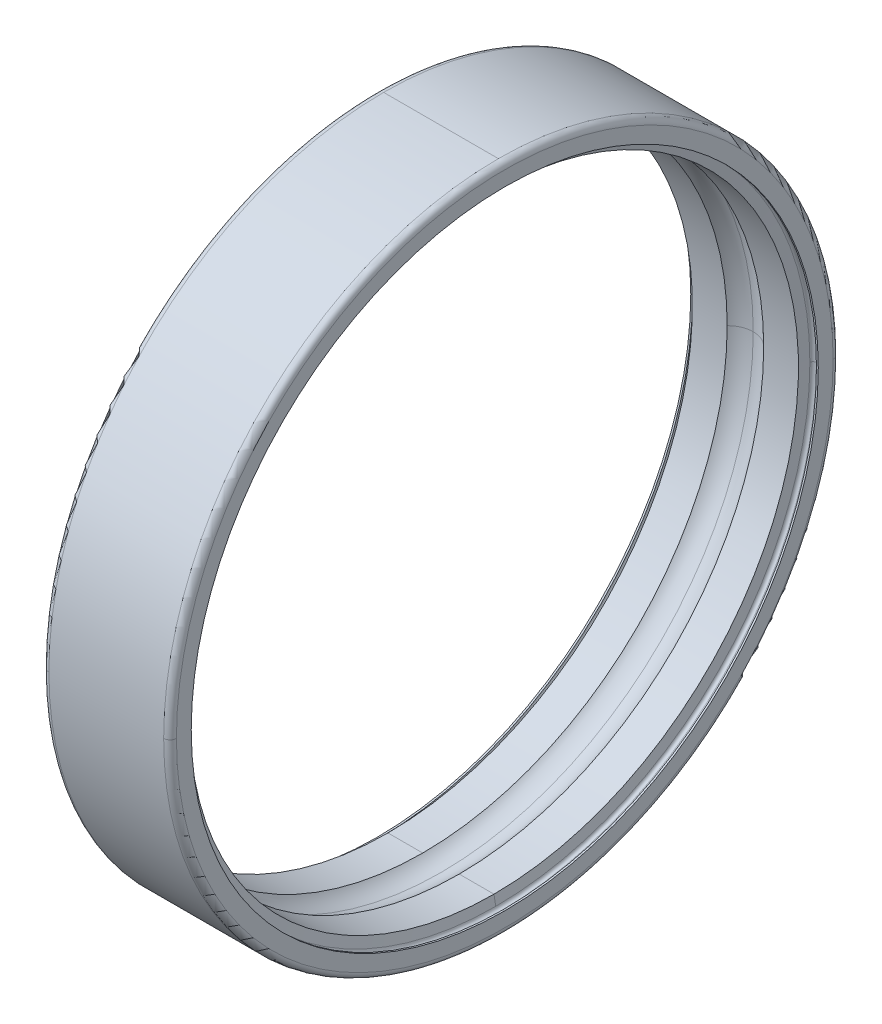
ISO-10303-21;
HEADER;
FILE_DESCRIPTION(('STEP AP214'),'2;1');
FILE_NAME('part.step','',(''),(''),'','','');
FILE_SCHEMA(('AUTOMOTIVE_DESIGN { 1 0 10303 214 1 1 1 1 }'));
ENDSEC;
DATA;
#1=APPLICATION_CONTEXT('core data for automotive mechanical design processes');
#2=APPLICATION_PROTOCOL_DEFINITION('international standard','automotive_design',2000,#1);
#3=PRODUCT_CONTEXT('',#1,'mechanical');
#4=PRODUCT('Part','Part','',(#3));
#5=PRODUCT_RELATED_PRODUCT_CATEGORY('part','',(#4));
#6=PRODUCT_DEFINITION_FORMATION('','',#4);
#7=PRODUCT_DEFINITION_CONTEXT('part definition',#1,'design');
#8=PRODUCT_DEFINITION('design','',#6,#7);
#9=PRODUCT_DEFINITION_SHAPE('','',#8);
#10=(LENGTH_UNIT() NAMED_UNIT(*) SI_UNIT(.MILLI.,.METRE.));
#11=(NAMED_UNIT(*) PLANE_ANGLE_UNIT() SI_UNIT($,.RADIAN.));
#12=(NAMED_UNIT(*) SI_UNIT($,.STERADIAN.) SOLID_ANGLE_UNIT());
#13=UNCERTAINTY_MEASURE_WITH_UNIT(LENGTH_MEASURE(1.E-05),#10,'distance_accuracy_value','');
#14=(GEOMETRIC_REPRESENTATION_CONTEXT(3) GLOBAL_UNCERTAINTY_ASSIGNED_CONTEXT((#13)) GLOBAL_UNIT_ASSIGNED_CONTEXT((#10,
#11,#12)) REPRESENTATION_CONTEXT('',''));
#15=CARTESIAN_POINT('',(0.,0.,0.));
#16=DIRECTION('',(0.,0.,1.));
#17=DIRECTION('',(1.,0.,0.));
#18=AXIS2_PLACEMENT_3D('',#15,#16,#17);
#19=CARTESIAN_POINT('',(3.829,0.,0.));
#20=DIRECTION('',(1.,0.,0.));
#21=DIRECTION('',(0.,0.,-1.));
#22=AXIS2_PLACEMENT_3D('',#19,#20,#21);
#23=TOROIDAL_SURFACE('',#22,9.835,0.114);
#24=CARTESIAN_POINT('',(3.829,0.,0.));
#25=DIRECTION('',(1.,0.,0.));
#26=DIRECTION('',(0.,0.,1.));
#27=AXIS2_PLACEMENT_3D('',#24,#25,#26);
#28=CIRCLE('',#27,9.949);
#29=CARTESIAN_POINT('',(3.829,0.,-9.949));
#30=VERTEX_POINT('',#29);
#31=CARTESIAN_POINT('',(3.829,0.,9.949));
#32=VERTEX_POINT('',#31);
#33=EDGE_CURVE('E184',#30,#32,#28,.T.);
#34=ORIENTED_EDGE('',*,*,#33,.T.);
#35=CARTESIAN_POINT('',(3.829,0.,9.835));
#36=DIRECTION('',(0.,-1.,0.));
#37=DIRECTION('',(0.,0.,1.));
#38=AXIS2_PLACEMENT_3D('',#35,#36,#37);
#39=CIRCLE('',#38,0.114);
#40=CARTESIAN_POINT('',(3.71673191615661,0.,9.85479589225403));
#41=VERTEX_POINT('',#40);
#42=EDGE_CURVE('E197',#32,#41,#39,.T.);
#43=ORIENTED_EDGE('',*,*,#42,.T.);
#44=CARTESIAN_POINT('',(3.71673191615661,0.,0.));
#45=DIRECTION('',(1.,0.,0.));
#46=DIRECTION('',(0.,1.,0.));
#47=AXIS2_PLACEMENT_3D('',#44,#45,#46);
#48=CIRCLE('',#47,9.85479589225403);
#49=CARTESIAN_POINT('',(3.71673191615661,9.85479589225403,0.));
#50=VERTEX_POINT('',#49);
#51=EDGE_CURVE('E31',#50,#41,#48,.T.);
#52=ORIENTED_EDGE('',*,*,#51,.F.);
#53=CARTESIAN_POINT('',(3.71673191615661,0.,0.));
#54=DIRECTION('',(1.,0.,0.));
#55=DIRECTION('',(0.,1.,0.));
#56=AXIS2_PLACEMENT_3D('',#53,#54,#55);
#57=CIRCLE('',#56,9.85479589225403);
#58=CARTESIAN_POINT('',(3.71673191615661,0.,-9.85479589225403));
#59=VERTEX_POINT('',#58);
#60=EDGE_CURVE('E185',#59,#50,#57,.T.);
#61=ORIENTED_EDGE('',*,*,#60,.F.);
#62=CARTESIAN_POINT('',(3.829,0.,-9.835));
#63=DIRECTION('',(0.,-1.,0.));
#64=DIRECTION('',(0.,0.,-1.));
#65=AXIS2_PLACEMENT_3D('',#62,#63,#64);
#66=CIRCLE('',#65,0.114);
#67=EDGE_CURVE('E181',#59,#30,#66,.T.);
#68=ORIENTED_EDGE('',*,*,#67,.T.);
#69=EDGE_LOOP('',(#34,#43,#52,#61,#68));
#70=FACE_BOUND('',#69,.T.);
#71=ADVANCED_FACE('F16',(#70),#23,.F.);
#72=CARTESIAN_POINT('',(3.9715,0.,0.));
#73=DIRECTION('',(1.,0.,0.));
#74=DIRECTION('',(0.,1.,0.));
#75=AXIS2_PLACEMENT_3D('',#72,#73,#74);
#76=CYLINDRICAL_SURFACE('',#75,9.835);
#77=DIRECTION('',(1.,0.,0.));
#78=VECTOR('',#77,1.);
#79=CARTESIAN_POINT('',(3.9715,9.835,0.));
#80=LINE('',#79,#78);
#81=CARTESIAN_POINT('',(3.943,9.835,0.));
#82=VERTEX_POINT('',#81);
#83=CARTESIAN_POINT('',(4.,9.835,0.));
#84=VERTEX_POINT('',#83);
#85=EDGE_CURVE('E313',#82,#84,#80,.T.);
#86=ORIENTED_EDGE('',*,*,#85,.T.);
#87=CARTESIAN_POINT('',(4.,0.,0.));
#88=DIRECTION('',(1.,0.,0.));
#89=DIRECTION('',(0.,1.,0.));
#90=AXIS2_PLACEMENT_3D('',#87,#88,#89);
#91=CIRCLE('',#90,9.835);
#92=CARTESIAN_POINT('',(4.,-9.835,0.));
#93=VERTEX_POINT('',#92);
#94=EDGE_CURVE('E11',#84,#93,#91,.T.);
#95=ORIENTED_EDGE('',*,*,#94,.T.);
#96=DIRECTION('',(-1.,0.,0.));
#97=VECTOR('',#96,1.);
#98=CARTESIAN_POINT('',(3.9715,-9.835,0.));
#99=LINE('',#98,#97);
#100=CARTESIAN_POINT('',(3.943,-9.835,0.));
#101=VERTEX_POINT('',#100);
#102=EDGE_CURVE('E321',#93,#101,#99,.T.);
#103=ORIENTED_EDGE('',*,*,#102,.T.);
#104=CARTESIAN_POINT('',(3.943,0.,0.));
#105=DIRECTION('',(1.,0.,0.));
#106=DIRECTION('',(0.,1.,0.));
#107=AXIS2_PLACEMENT_3D('',#104,#105,#106);
#108=CIRCLE('',#107,9.835);
#109=CARTESIAN_POINT('',(3.943,0.,9.835));
#110=VERTEX_POINT('',#109);
#111=EDGE_CURVE('E201',#110,#101,#108,.T.);
#112=ORIENTED_EDGE('',*,*,#111,.F.);
#113=CARTESIAN_POINT('',(3.943,0.,0.));
#114=DIRECTION('',(1.,0.,0.));
#115=DIRECTION('',(0.,1.,0.));
#116=AXIS2_PLACEMENT_3D('',#113,#114,#115);
#117=CIRCLE('',#116,9.835);
#118=EDGE_CURVE('E253',#82,#110,#117,.T.);
#119=ORIENTED_EDGE('',*,*,#118,.F.);
#120=EDGE_LOOP('',(#86,#95,#103,#112,#119));
#121=FACE_BOUND('',#120,.T.);
#122=ADVANCED_FACE('F18',(#121),#76,.F.);
#123=CARTESIAN_POINT('',(4.,10.0675,0.));
#124=DIRECTION('',(1.,0.,0.));
#125=DIRECTION('',(0.,1.,0.));
#126=AXIS2_PLACEMENT_3D('',#123,#124,#125);
#127=PLANE('',#126);
#128=ORIENTED_EDGE('',*,*,#94,.F.);
#129=CARTESIAN_POINT('',(4.,0.,0.));
#130=DIRECTION('',(1.,0.,0.));
#131=DIRECTION('',(0.,1.,0.));
#132=AXIS2_PLACEMENT_3D('',#129,#130,#131);
#133=CIRCLE('',#132,9.835);
#134=EDGE_CURVE('E328',#93,#84,#133,.T.);
#135=ORIENTED_EDGE('',*,*,#134,.F.);
#136=EDGE_LOOP('',(#128,#135));
#137=FACE_BOUND('',#136,.T.);
#138=CARTESIAN_POINT('',(4.,0.,0.));
#139=DIRECTION('',(1.,0.,0.));
#140=DIRECTION('',(0.,1.,0.));
#141=AXIS2_PLACEMENT_3D('',#138,#139,#140);
#142=CIRCLE('',#141,10.3);
#143=CARTESIAN_POINT('',(4.,0.,10.3));
#144=VERTEX_POINT('',#143);
#145=CARTESIAN_POINT('',(4.,0.,-10.3));
#146=VERTEX_POINT('',#145);
#147=EDGE_CURVE('E24',#144,#146,#142,.T.);
#148=ORIENTED_EDGE('',*,*,#147,.T.);
#149=CARTESIAN_POINT('',(4.,0.,0.));
#150=DIRECTION('',(1.,0.,0.));
#151=DIRECTION('',(0.,1.,0.));
#152=AXIS2_PLACEMENT_3D('',#149,#150,#151);
#153=CIRCLE('',#152,10.3);
#154=EDGE_CURVE('E338',#146,#144,#153,.T.);
#155=ORIENTED_EDGE('',*,*,#154,.T.);
#156=EDGE_LOOP('',(#148,#155));
#157=FACE_BOUND('',#156,.T.);
#158=ADVANCED_FACE('F402',(#137,#157),#127,.T.);
#159=CARTESIAN_POINT('',(3.8,0.,0.));
#160=DIRECTION('',(1.,0.,0.));
#161=DIRECTION('',(0.,0.,-1.));
#162=AXIS2_PLACEMENT_3D('',#159,#160,#161);
#163=TOROIDAL_SURFACE('',#162,10.3,0.2);
#164=CARTESIAN_POINT('',(3.8,0.,-10.3));
#165=DIRECTION('',(0.,-1.,0.));
#166=DIRECTION('',(0.,0.,-1.));
#167=AXIS2_PLACEMENT_3D('',#164,#165,#166);
#168=CIRCLE('',#167,0.2);
#169=CARTESIAN_POINT('',(3.8,0.,-10.5));
#170=VERTEX_POINT('',#169);
#171=EDGE_CURVE('E251',#170,#146,#168,.T.);
#172=ORIENTED_EDGE('',*,*,#171,.T.);
#173=ORIENTED_EDGE('',*,*,#147,.F.);
#174=CARTESIAN_POINT('',(3.8,0.,10.3));
#175=DIRECTION('',(0.,-1.,0.));
#176=DIRECTION('',(0.,0.,1.));
#177=AXIS2_PLACEMENT_3D('',#174,#175,#176);
#178=CIRCLE('',#177,0.2);
#179=CARTESIAN_POINT('',(3.8,0.,10.5));
#180=VERTEX_POINT('',#179);
#181=EDGE_CURVE('E335',#144,#180,#178,.T.);
#182=ORIENTED_EDGE('',*,*,#181,.T.);
#183=CARTESIAN_POINT('',(3.8,0.,0.));
#184=DIRECTION('',(1.,0.,0.));
#185=DIRECTION('',(0.,1.,0.));
#186=AXIS2_PLACEMENT_3D('',#183,#184,#185);
#187=CIRCLE('',#186,10.5);
#188=CARTESIAN_POINT('',(3.8,-10.5,0.));
#189=VERTEX_POINT('',#188);
#190=EDGE_CURVE('E317',#180,#189,#187,.T.);
#191=ORIENTED_EDGE('',*,*,#190,.T.);
#192=CARTESIAN_POINT('',(3.8,0.,0.));
#193=DIRECTION('',(1.,0.,0.));
#194=DIRECTION('',(0.,1.,0.));
#195=AXIS2_PLACEMENT_3D('',#192,#193,#194);
#196=CIRCLE('',#195,10.5);
#197=EDGE_CURVE('E233',#189,#170,#196,.T.);
#198=ORIENTED_EDGE('',*,*,#197,.T.);
#199=EDGE_LOOP('',(#172,#173,#182,#191,#198));
#200=FACE_BOUND('',#199,.T.);
#201=ADVANCED_FACE('F408',(#200),#163,.T.);
#202=CARTESIAN_POINT('',(2.,0.,0.));
#203=DIRECTION('',(1.,0.,0.));
#204=DIRECTION('',(0.,1.,0.));
#205=AXIS2_PLACEMENT_3D('',#202,#203,#204);
#206=CYLINDRICAL_SURFACE('',#205,10.5);
#207=DIRECTION('',(1.,0.,0.));
#208=VECTOR('',#207,1.);
#209=CARTESIAN_POINT('',(2.,10.5,0.));
#210=LINE('',#209,#208);
#211=CARTESIAN_POINT('',(0.2,10.5,0.));
#212=VERTEX_POINT('',#211);
#213=CARTESIAN_POINT('',(3.8,10.5,0.));
#214=VERTEX_POINT('',#213);
#215=EDGE_CURVE('E341',#212,#214,#210,.T.);
#216=ORIENTED_EDGE('',*,*,#215,.T.);
#217=CARTESIAN_POINT('',(3.8,0.,0.));
#218=DIRECTION('',(1.,0.,0.));
#219=DIRECTION('',(0.,1.,0.));
#220=AXIS2_PLACEMENT_3D('',#217,#218,#219);
#221=CIRCLE('',#220,10.5);
#222=EDGE_CURVE('E247',#170,#214,#221,.T.);
#223=ORIENTED_EDGE('',*,*,#222,.F.);
#224=ORIENTED_EDGE('',*,*,#197,.F.);
#225=DIRECTION('',(-1.,0.,0.));
#226=VECTOR('',#225,1.);
#227=CARTESIAN_POINT('',(2.,-10.5,0.));
#228=LINE('',#227,#226);
#229=CARTESIAN_POINT('',(0.2,-10.5,0.));
#230=VERTEX_POINT('',#229);
#231=EDGE_CURVE('E314',#189,#230,#228,.T.);
#232=ORIENTED_EDGE('',*,*,#231,.T.);
#233=CARTESIAN_POINT('',(0.2,0.,0.));
#234=DIRECTION('',(1.,0.,0.));
#235=DIRECTION('',(0.,1.,0.));
#236=AXIS2_PLACEMENT_3D('',#233,#234,#235);
#237=CIRCLE('',#236,10.5);
#238=CARTESIAN_POINT('',(0.2,0.,-10.5));
#239=VERTEX_POINT('',#238);
#240=EDGE_CURVE('E234',#230,#239,#237,.T.);
#241=ORIENTED_EDGE('',*,*,#240,.T.);
#242=CARTESIAN_POINT('',(0.2,0.,0.));
#243=DIRECTION('',(1.,0.,0.));
#244=DIRECTION('',(0.,1.,0.));
#245=AXIS2_PLACEMENT_3D('',#242,#243,#244);
#246=CIRCLE('',#245,10.5);
#247=EDGE_CURVE('E227',#239,#212,#246,.T.);
#248=ORIENTED_EDGE('',*,*,#247,.T.);
#249=EDGE_LOOP('',(#216,#223,#224,#232,#241,#248));
#250=FACE_BOUND('',#249,.T.);
#251=ADVANCED_FACE('F412',(#250),#206,.T.);
#252=CARTESIAN_POINT('',(0.2,0.,0.));
#253=DIRECTION('',(1.,0.,0.));
#254=DIRECTION('',(0.,0.,-1.));
#255=AXIS2_PLACEMENT_3D('',#252,#253,#254);
#256=TOROIDAL_SURFACE('',#255,10.3,0.2);
#257=CARTESIAN_POINT('',(0.2,0.,-10.3));
#258=DIRECTION('',(0.,-1.,0.));
#259=DIRECTION('',(0.,0.,-1.));
#260=AXIS2_PLACEMENT_3D('',#257,#258,#259);
#261=CIRCLE('',#260,0.2);
#262=CARTESIAN_POINT('',(0.,0.,-10.3));
#263=VERTEX_POINT('',#262);
#264=EDGE_CURVE('E243',#263,#239,#261,.T.);
#265=ORIENTED_EDGE('',*,*,#264,.T.);
#266=ORIENTED_EDGE('',*,*,#240,.F.);
#267=CARTESIAN_POINT('',(0.2,0.,0.));
#268=DIRECTION('',(1.,0.,0.));
#269=DIRECTION('',(0.,1.,0.));
#270=AXIS2_PLACEMENT_3D('',#267,#268,#269);
#271=CIRCLE('',#270,10.5);
#272=CARTESIAN_POINT('',(0.2,0.,10.5));
#273=VERTEX_POINT('',#272);
#274=EDGE_CURVE('E318',#273,#230,#271,.T.);
#275=ORIENTED_EDGE('',*,*,#274,.F.);
#276=CARTESIAN_POINT('',(0.2,0.,10.3));
#277=DIRECTION('',(0.,-1.,0.));
#278=DIRECTION('',(0.,0.,1.));
#279=AXIS2_PLACEMENT_3D('',#276,#277,#278);
#280=CIRCLE('',#279,0.2);
#281=CARTESIAN_POINT('',(0.,0.,10.3));
#282=VERTEX_POINT('',#281);
#283=EDGE_CURVE('E242',#273,#282,#280,.T.);
#284=ORIENTED_EDGE('',*,*,#283,.T.);
#285=CARTESIAN_POINT('',(0.,0.,0.));
#286=DIRECTION('',(1.,0.,0.));
#287=DIRECTION('',(0.,1.,0.));
#288=AXIS2_PLACEMENT_3D('',#285,#286,#287);
#289=CIRCLE('',#288,10.3);
#290=EDGE_CURVE('E221',#282,#263,#289,.T.);
#291=ORIENTED_EDGE('',*,*,#290,.T.);
#292=EDGE_LOOP('',(#265,#266,#275,#284,#291));
#293=FACE_BOUND('',#292,.T.);
#294=ADVANCED_FACE('F424',(#293),#256,.T.);
#295=CARTESIAN_POINT('',(0.,10.0675,0.));
#296=DIRECTION('',(-1.,0.,0.));
#297=DIRECTION('',(0.,0.,1.));
#298=AXIS2_PLACEMENT_3D('',#295,#296,#297);
#299=PLANE('',#298);
#300=CARTESIAN_POINT('',(0.,0.,0.));
#301=DIRECTION('',(1.,0.,0.));
#302=DIRECTION('',(0.,1.,0.));
#303=AXIS2_PLACEMENT_3D('',#300,#301,#302);
#304=CIRCLE('',#303,9.835);
#305=CARTESIAN_POINT('',(0.,9.835,0.));
#306=VERTEX_POINT('',#305);
#307=CARTESIAN_POINT('',(0.,-9.835,0.));
#308=VERTEX_POINT('',#307);
#309=EDGE_CURVE('E219',#306,#308,#304,.T.);
#310=ORIENTED_EDGE('',*,*,#309,.T.);
#311=CARTESIAN_POINT('',(0.,0.,0.));
#312=DIRECTION('',(1.,0.,0.));
#313=DIRECTION('',(0.,1.,0.));
#314=AXIS2_PLACEMENT_3D('',#311,#312,#313);
#315=CIRCLE('',#314,9.835);
#316=EDGE_CURVE('E226',#308,#306,#315,.T.);
#317=ORIENTED_EDGE('',*,*,#316,.T.);
#318=EDGE_LOOP('',(#310,#317));
#319=FACE_BOUND('',#318,.T.);
#320=CARTESIAN_POINT('',(0.,0.,0.));
#321=DIRECTION('',(1.,0.,0.));
#322=DIRECTION('',(0.,1.,0.));
#323=AXIS2_PLACEMENT_3D('',#320,#321,#322);
#324=CIRCLE('',#323,10.3);
#325=EDGE_CURVE('E239',#263,#282,#324,.T.);
#326=ORIENTED_EDGE('',*,*,#325,.F.);
#327=ORIENTED_EDGE('',*,*,#290,.F.);
#328=EDGE_LOOP('',(#326,#327));
#329=FACE_BOUND('',#328,.T.);
#330=ADVANCED_FACE('F427',(#319,#329),#299,.T.);
#331=CARTESIAN_POINT('',(0.0285,0.,0.));
#332=DIRECTION('',(1.,0.,0.));
#333=DIRECTION('',(0.,1.,0.));
#334=AXIS2_PLACEMENT_3D('',#331,#332,#333);
#335=CYLINDRICAL_SURFACE('',#334,9.835);
#336=DIRECTION('',(1.,0.,0.));
#337=VECTOR('',#336,1.);
#338=CARTESIAN_POINT('',(0.0285,9.835,0.));
#339=LINE('',#338,#337);
#340=CARTESIAN_POINT('',(0.057,9.835,0.));
#341=VERTEX_POINT('',#340);
#342=EDGE_CURVE('E223',#306,#341,#339,.T.);
#343=ORIENTED_EDGE('',*,*,#342,.T.);
#344=CARTESIAN_POINT('',(0.057,0.,0.));
#345=DIRECTION('',(1.,0.,0.));
#346=DIRECTION('',(0.,1.,0.));
#347=AXIS2_PLACEMENT_3D('',#344,#345,#346);
#348=CIRCLE('',#347,9.835);
#349=CARTESIAN_POINT('',(0.057,0.,9.835));
#350=VERTEX_POINT('',#349);
#351=EDGE_CURVE('E222',#341,#350,#348,.T.);
#352=ORIENTED_EDGE('',*,*,#351,.T.);
#353=CARTESIAN_POINT('',(0.057,0.,0.));
#354=DIRECTION('',(1.,0.,0.));
#355=DIRECTION('',(0.,1.,0.));
#356=AXIS2_PLACEMENT_3D('',#353,#354,#355);
#357=CIRCLE('',#356,9.835);
#358=CARTESIAN_POINT('',(0.057,-9.835,0.));
#359=VERTEX_POINT('',#358);
#360=EDGE_CURVE('E371',#350,#359,#357,.T.);
#361=ORIENTED_EDGE('',*,*,#360,.T.);
#362=DIRECTION('',(-1.,0.,0.));
#363=VECTOR('',#362,1.);
#364=CARTESIAN_POINT('',(0.0285,-9.835,0.));
#365=LINE('',#364,#363);
#366=EDGE_CURVE('E360',#359,#308,#365,.T.);
#367=ORIENTED_EDGE('',*,*,#366,.T.);
#368=ORIENTED_EDGE('',*,*,#309,.F.);
#369=EDGE_LOOP('',(#343,#352,#361,#367,#368));
#370=FACE_BOUND('',#369,.T.);
#371=ADVANCED_FACE('F429',(#370),#335,.F.);
#372=CARTESIAN_POINT('',(0.171,0.,0.));
#373=DIRECTION('',(1.,0.,0.));
#374=DIRECTION('',(0.,0.,-1.));
#375=AXIS2_PLACEMENT_3D('',#372,#373,#374);
#376=TOROIDAL_SURFACE('',#375,9.835,0.114);
#377=CARTESIAN_POINT('',(0.171,0.,0.));
#378=DIRECTION('',(1.,0.,0.));
#379=DIRECTION('',(0.,0.,1.));
#380=AXIS2_PLACEMENT_3D('',#377,#378,#379);
#381=CIRCLE('',#380,9.949);
#382=CARTESIAN_POINT('',(0.171,0.,-9.949));
#383=VERTEX_POINT('',#382);
#384=CARTESIAN_POINT('',(0.171,0.,9.949));
#385=VERTEX_POINT('',#384);
#386=EDGE_CURVE('E266',#383,#385,#381,.T.);
#387=ORIENTED_EDGE('',*,*,#386,.T.);
#388=CARTESIAN_POINT('',(0.171,0.,9.835));
#389=DIRECTION('',(0.,-1.,0.));
#390=DIRECTION('',(0.,0.,1.));
#391=AXIS2_PLACEMENT_3D('',#388,#389,#390);
#392=CIRCLE('',#391,0.114);
#393=EDGE_CURVE('E373',#385,#350,#392,.T.);
#394=ORIENTED_EDGE('',*,*,#393,.T.);
#395=ORIENTED_EDGE('',*,*,#351,.F.);
#396=CARTESIAN_POINT('',(0.057,0.,0.));
#397=DIRECTION('',(1.,0.,0.));
#398=DIRECTION('',(0.,1.,0.));
#399=AXIS2_PLACEMENT_3D('',#396,#397,#398);
#400=CIRCLE('',#399,9.835);
#401=CARTESIAN_POINT('',(0.057,0.,-9.835));
#402=VERTEX_POINT('',#401);
#403=EDGE_CURVE('E366',#402,#341,#400,.T.);
#404=ORIENTED_EDGE('',*,*,#403,.F.);
#405=CARTESIAN_POINT('',(0.171,0.,-9.835));
#406=DIRECTION('',(0.,-1.,0.));
#407=DIRECTION('',(0.,0.,-1.));
#408=AXIS2_PLACEMENT_3D('',#405,#406,#407);
#409=CIRCLE('',#408,0.114);
#410=EDGE_CURVE('E369',#402,#383,#409,.T.);
#411=ORIENTED_EDGE('',*,*,#410,.T.);
#412=EDGE_LOOP('',(#387,#394,#395,#404,#411));
#413=FACE_BOUND('',#412,.T.);
#414=ADVANCED_FACE('F437',(#413),#376,.F.);
#415=CARTESIAN_POINT('',(0.31013995355014,0.,0.));
#416=DIRECTION('',(-1.,0.,0.));
#417=DIRECTION('',(0.,1.,0.));
#418=AXIS2_PLACEMENT_3D('',#415,#416,#417);
#419=CONICAL_SURFACE('',#418,9.70239794612702,1.39626340159546);
#420=DIRECTION('',(0.173648177666931,-0.984807753012208,0.));
#421=VECTOR('',#420,1.);
#422=CARTESIAN_POINT('',(0.31013995355014,9.70239794612702,0.));
#423=LINE('',#422,#421);
#424=CARTESIAN_POINT('',(0.283268083843392,9.85479589225403,0.));
#425=VERTEX_POINT('',#424);
#426=CARTESIAN_POINT('',(0.337011823256887,9.55,0.));
#427=VERTEX_POINT('',#426);
#428=EDGE_CURVE('E376',#425,#427,#423,.T.);
#429=ORIENTED_EDGE('',*,*,#428,.T.);
#430=CARTESIAN_POINT('',(0.337011823256887,0.,0.));
#431=DIRECTION('',(1.,0.,0.));
#432=DIRECTION('',(0.,1.,0.));
#433=AXIS2_PLACEMENT_3D('',#430,#431,#432);
#434=CIRCLE('',#433,9.55);
#435=CARTESIAN_POINT('',(0.337011823256888,-9.55,0.));
#436=VERTEX_POINT('',#435);
#437=EDGE_CURVE('E236',#427,#436,#434,.T.);
#438=ORIENTED_EDGE('',*,*,#437,.T.);
#439=DIRECTION('',(-0.173648177666931,-0.984807753012208,0.));
#440=VECTOR('',#439,1.);
#441=CARTESIAN_POINT('',(0.31013995355014,-9.70239794612702,0.));
#442=LINE('',#441,#440);
#443=CARTESIAN_POINT('',(0.283268083843392,-9.85479589225403,0.));
#444=VERTEX_POINT('',#443);
#445=EDGE_CURVE('E326',#436,#444,#442,.T.);
#446=ORIENTED_EDGE('',*,*,#445,.T.);
#447=CARTESIAN_POINT('',(0.283268083843392,0.,0.));
#448=DIRECTION('',(1.,0.,0.));
#449=DIRECTION('',(0.,1.,0.));
#450=AXIS2_PLACEMENT_3D('',#447,#448,#449);
#451=CIRCLE('',#450,9.85479589225403);
#452=CARTESIAN_POINT('',(0.283268083843392,0.,9.85479589225403));
#453=VERTEX_POINT('',#452);
#454=EDGE_CURVE('E295',#453,#444,#451,.T.);
#455=ORIENTED_EDGE('',*,*,#454,.F.);
#456=CARTESIAN_POINT('',(0.283268083843392,0.,0.));
#457=DIRECTION('',(1.,0.,0.));
#458=DIRECTION('',(0.,1.,0.));
#459=AXIS2_PLACEMENT_3D('',#456,#457,#458);
#460=CIRCLE('',#459,9.85479589225403);
#461=EDGE_CURVE('E275',#425,#453,#460,.T.);
#462=ORIENTED_EDGE('',*,*,#461,.F.);
#463=EDGE_LOOP('',(#429,#438,#446,#455,#462));
#464=FACE_BOUND('',#463,.T.);
#465=ADVANCED_FACE('F478',(#464),#419,.F.);
#466=CARTESIAN_POINT('',(0.882177428937674,0.,0.));
#467=DIRECTION('',(1.,0.,0.));
#468=DIRECTION('',(0.,1.,0.));
#469=AXIS2_PLACEMENT_3D('',#466,#467,#468);
#470=CYLINDRICAL_SURFACE('',#469,9.55);
#471=DIRECTION('',(1.,0.,0.));
#472=VECTOR('',#471,1.);
#473=CARTESIAN_POINT('',(0.882177428937674,9.55,0.));
#474=LINE('',#473,#472);
#475=CARTESIAN_POINT('',(1.42734303461846,9.55,0.));
#476=VERTEX_POINT('',#475);
#477=EDGE_CURVE('E325',#427,#476,#474,.T.);
#478=ORIENTED_EDGE('',*,*,#477,.T.);
#479=CARTESIAN_POINT('',(1.42734303461846,0.,0.));
#480=DIRECTION('',(1.,0.,0.));
#481=DIRECTION('',(0.,1.,0.));
#482=AXIS2_PLACEMENT_3D('',#479,#480,#481);
#483=CIRCLE('',#482,9.55);
#484=CARTESIAN_POINT('',(1.42734303461846,0.,9.55));
#485=VERTEX_POINT('',#484);
#486=EDGE_CURVE('E238',#476,#485,#483,.T.);
#487=ORIENTED_EDGE('',*,*,#486,.T.);
#488=CARTESIAN_POINT('',(1.42734303461846,0.,0.));
#489=DIRECTION('',(1.,0.,0.));
#490=DIRECTION('',(0.,1.,0.));
#491=AXIS2_PLACEMENT_3D('',#488,#489,#490);
#492=CIRCLE('',#491,9.55);
#493=CARTESIAN_POINT('',(1.42734303461846,-9.55,0.));
#494=VERTEX_POINT('',#493);
#495=EDGE_CURVE('E310',#485,#494,#492,.T.);
#496=ORIENTED_EDGE('',*,*,#495,.T.);
#497=DIRECTION('',(-1.,0.,0.));
#498=VECTOR('',#497,1.);
#499=CARTESIAN_POINT('',(0.882177428937674,-9.55,0.));
#500=LINE('',#499,#498);
#501=EDGE_CURVE('E382',#494,#436,#500,.T.);
#502=ORIENTED_EDGE('',*,*,#501,.T.);
#503=ORIENTED_EDGE('',*,*,#437,.F.);
#504=EDGE_LOOP('',(#478,#487,#496,#502,#503));
#505=FACE_BOUND('',#504,.T.);
#506=ADVANCED_FACE('F475',(#505),#470,.F.);
#507=CARTESIAN_POINT('',(2.,0.,0.));
#508=DIRECTION('',(1.,0.,0.));
#509=DIRECTION('',(0.,0.,-1.));
#510=AXIS2_PLACEMENT_3D('',#507,#508,#509);
#511=TOROIDAL_SURFACE('',#510,9.,0.794);
#512=CARTESIAN_POINT('',(2.,0.,0.));
#513=DIRECTION('',(1.,0.,0.));
#514=DIRECTION('',(0.,0.,1.));
#515=AXIS2_PLACEMENT_3D('',#512,#513,#514);
#516=CIRCLE('',#515,9.794);
#517=CARTESIAN_POINT('',(2.,0.,-9.794));
#518=VERTEX_POINT('',#517);
#519=CARTESIAN_POINT('',(2.,0.,9.794));
#520=VERTEX_POINT('',#519);
#521=EDGE_CURVE('E260',#518,#520,#516,.T.);
#522=ORIENTED_EDGE('',*,*,#521,.T.);
#523=CARTESIAN_POINT('',(2.,0.,9.));
#524=DIRECTION('',(0.,-1.,0.));
#525=DIRECTION('',(0.,0.,1.));
#526=AXIS2_PLACEMENT_3D('',#523,#524,#525);
#527=CIRCLE('',#526,0.794);
#528=EDGE_CURVE('E264',#520,#485,#527,.T.);
#529=ORIENTED_EDGE('',*,*,#528,.T.);
#530=ORIENTED_EDGE('',*,*,#486,.F.);
#531=CARTESIAN_POINT('',(1.42734303461846,0.,0.));
#532=DIRECTION('',(1.,0.,0.));
#533=DIRECTION('',(0.,1.,0.));
#534=AXIS2_PLACEMENT_3D('',#531,#532,#533);
#535=CIRCLE('',#534,9.55);
#536=CARTESIAN_POINT('',(1.42734303461846,0.,-9.55));
#537=VERTEX_POINT('',#536);
#538=EDGE_CURVE('E301',#537,#476,#535,.T.);
#539=ORIENTED_EDGE('',*,*,#538,.F.);
#540=CARTESIAN_POINT('',(2.,0.,-9.));
#541=DIRECTION('',(0.,-1.,0.));
#542=DIRECTION('',(0.,0.,-1.));
#543=AXIS2_PLACEMENT_3D('',#540,#541,#542);
#544=CIRCLE('',#543,0.794);
#545=EDGE_CURVE('E304',#537,#518,#544,.T.);
#546=ORIENTED_EDGE('',*,*,#545,.T.);
#547=EDGE_LOOP('',(#522,#529,#530,#539,#546));
#548=FACE_BOUND('',#547,.T.);
#549=ADVANCED_FACE('F474',(#548),#511,.F.);
#550=CARTESIAN_POINT('',(3.11782257106233,0.,0.));
#551=DIRECTION('',(1.,0.,0.));
#552=DIRECTION('',(0.,1.,0.));
#553=AXIS2_PLACEMENT_3D('',#550,#551,#552);
#554=CYLINDRICAL_SURFACE('',#553,9.55);
#555=DIRECTION('',(1.,0.,0.));
#556=VECTOR('',#555,1.);
#557=CARTESIAN_POINT('',(3.11782257106233,9.55,0.));
#558=LINE('',#557,#556);
#559=CARTESIAN_POINT('',(2.57265696538154,9.55,0.));
#560=VERTEX_POINT('',#559);
#561=CARTESIAN_POINT('',(3.66298817674311,9.55,0.));
#562=VERTEX_POINT('',#561);
#563=EDGE_CURVE('E261',#560,#562,#558,.T.);
#564=ORIENTED_EDGE('',*,*,#563,.T.);
#565=CARTESIAN_POINT('',(3.66298817674311,0.,0.));
#566=DIRECTION('',(1.,0.,0.));
#567=DIRECTION('',(0.,1.,0.));
#568=AXIS2_PLACEMENT_3D('',#565,#566,#567);
#569=CIRCLE('',#568,9.55);
#570=CARTESIAN_POINT('',(3.66298817674311,-9.55,0.));
#571=VERTEX_POINT('',#570);
#572=EDGE_CURVE('E39',#562,#571,#569,.T.);
#573=ORIENTED_EDGE('',*,*,#572,.T.);
#574=DIRECTION('',(-1.,0.,0.));
#575=VECTOR('',#574,1.);
#576=CARTESIAN_POINT('',(3.11782257106233,-9.55,0.));
#577=LINE('',#576,#575);
#578=CARTESIAN_POINT('',(2.57265696538154,-9.55,0.));
#579=VERTEX_POINT('',#578);
#580=EDGE_CURVE('E263',#571,#579,#577,.T.);
#581=ORIENTED_EDGE('',*,*,#580,.T.);
#582=CARTESIAN_POINT('',(2.57265696538154,0.,0.));
#583=DIRECTION('',(1.,0.,0.));
#584=DIRECTION('',(0.,1.,0.));
#585=AXIS2_PLACEMENT_3D('',#582,#583,#584);
#586=CIRCLE('',#585,9.55);
#587=CARTESIAN_POINT('',(2.57265696538154,0.,9.55));
#588=VERTEX_POINT('',#587);
#589=EDGE_CURVE('E285',#588,#579,#586,.T.);
#590=ORIENTED_EDGE('',*,*,#589,.F.);
#591=CARTESIAN_POINT('',(2.57265696538154,0.,0.));
#592=DIRECTION('',(1.,0.,0.));
#593=DIRECTION('',(0.,1.,0.));
#594=AXIS2_PLACEMENT_3D('',#591,#592,#593);
#595=CIRCLE('',#594,9.55);
#596=EDGE_CURVE('E231',#560,#588,#595,.T.);
#597=ORIENTED_EDGE('',*,*,#596,.F.);
#598=EDGE_LOOP('',(#564,#573,#581,#590,#597));
#599=FACE_BOUND('',#598,.T.);
#600=ADVANCED_FACE('F470',(#599),#554,.F.);
#601=CARTESIAN_POINT('',(3.68986004644986,0.,0.));
#602=DIRECTION('',(1.,0.,0.));
#603=DIRECTION('',(0.,1.,0.));
#604=AXIS2_PLACEMENT_3D('',#601,#602,#603);
#605=CONICAL_SURFACE('',#604,9.70239794612702,1.39626340159546);
#606=DIRECTION('',(0.173648177666931,0.984807753012208,0.));
#607=VECTOR('',#606,1.);
#608=CARTESIAN_POINT('',(3.68986004644986,9.70239794612702,0.));
#609=LINE('',#608,#607);
#610=EDGE_CURVE('E392',#562,#50,#609,.T.);
#611=ORIENTED_EDGE('',*,*,#610,.T.);
#612=ORIENTED_EDGE('',*,*,#51,.T.);
#613=CARTESIAN_POINT('',(3.71673191615661,0.,0.));
#614=DIRECTION('',(1.,0.,0.));
#615=DIRECTION('',(0.,1.,0.));
#616=AXIS2_PLACEMENT_3D('',#613,#614,#615);
#617=CIRCLE('',#616,9.85479589225403);
#618=CARTESIAN_POINT('',(3.71673191615661,-9.85479589225403,0.));
#619=VERTEX_POINT('',#618);
#620=EDGE_CURVE('E307',#41,#619,#617,.T.);
#621=ORIENTED_EDGE('',*,*,#620,.T.);
#622=DIRECTION('',(-0.173648177666931,0.984807753012208,0.));
#623=VECTOR('',#622,1.);
#624=CARTESIAN_POINT('',(3.68986004644986,-9.70239794612702,0.));
#625=LINE('',#624,#623);
#626=EDGE_CURVE('E395',#619,#571,#625,.T.);
#627=ORIENTED_EDGE('',*,*,#626,.T.);
#628=ORIENTED_EDGE('',*,*,#572,.F.);
#629=EDGE_LOOP('',(#611,#612,#621,#627,#628));
#630=FACE_BOUND('',#629,.T.);
#631=ADVANCED_FACE('F466',(#630),#605,.F.);
#632=CARTESIAN_POINT('',(3.68986004644986,0.,0.));
#633=DIRECTION('',(1.,0.,0.));
#634=DIRECTION('',(0.,1.,0.));
#635=AXIS2_PLACEMENT_3D('',#632,#633,#634);
#636=CONICAL_SURFACE('',#635,9.70239794612702,1.39626340159546);
#637=ORIENTED_EDGE('',*,*,#610,.F.);
#638=CARTESIAN_POINT('',(3.66298817674311,0.,0.));
#639=DIRECTION('',(1.,0.,0.));
#640=DIRECTION('',(0.,1.,0.));
#641=AXIS2_PLACEMENT_3D('',#638,#639,#640);
#642=CIRCLE('',#641,9.55);
#643=EDGE_CURVE('E287',#571,#562,#642,.T.);
#644=ORIENTED_EDGE('',*,*,#643,.F.);
#645=ORIENTED_EDGE('',*,*,#626,.F.);
#646=CARTESIAN_POINT('',(3.71673191615661,0.,0.));
#647=DIRECTION('',(1.,0.,0.));
#648=DIRECTION('',(0.,1.,0.));
#649=AXIS2_PLACEMENT_3D('',#646,#647,#648);
#650=CIRCLE('',#649,9.85479589225403);
#651=EDGE_CURVE('E189',#619,#59,#650,.T.);
#652=ORIENTED_EDGE('',*,*,#651,.T.);
#653=ORIENTED_EDGE('',*,*,#60,.T.);
#654=EDGE_LOOP('',(#637,#644,#645,#652,#653));
#655=FACE_BOUND('',#654,.T.);
#656=ADVANCED_FACE('F462',(#655),#636,.F.);
#657=CARTESIAN_POINT('',(3.11782257106233,0.,0.));
#658=DIRECTION('',(1.,0.,0.));
#659=DIRECTION('',(0.,1.,0.));
#660=AXIS2_PLACEMENT_3D('',#657,#658,#659);
#661=CYLINDRICAL_SURFACE('',#660,9.55);
#662=ORIENTED_EDGE('',*,*,#563,.F.);
#663=CARTESIAN_POINT('',(2.57265696538154,0.,0.));
#664=DIRECTION('',(1.,0.,0.));
#665=DIRECTION('',(0.,1.,0.));
#666=AXIS2_PLACEMENT_3D('',#663,#664,#665);
#667=CIRCLE('',#666,9.55);
#668=CARTESIAN_POINT('',(2.57265696538154,0.,-9.55));
#669=VERTEX_POINT('',#668);
#670=EDGE_CURVE('E228',#669,#560,#667,.T.);
#671=ORIENTED_EDGE('',*,*,#670,.F.);
#672=CARTESIAN_POINT('',(2.57265696538154,0.,0.));
#673=DIRECTION('',(1.,0.,0.));
#674=DIRECTION('',(0.,1.,0.));
#675=AXIS2_PLACEMENT_3D('',#672,#673,#674);
#676=CIRCLE('',#675,9.55);
#677=EDGE_CURVE('E290',#579,#669,#676,.T.);
#678=ORIENTED_EDGE('',*,*,#677,.F.);
#679=ORIENTED_EDGE('',*,*,#580,.F.);
#680=ORIENTED_EDGE('',*,*,#643,.T.);
#681=EDGE_LOOP('',(#662,#671,#678,#679,#680));
#682=FACE_BOUND('',#681,.T.);
#683=ADVANCED_FACE('F458',(#682),#661,.F.);
#684=CARTESIAN_POINT('',(2.,0.,0.));
#685=DIRECTION('',(1.,0.,0.));
#686=DIRECTION('',(0.,0.,-1.));
#687=AXIS2_PLACEMENT_3D('',#684,#685,#686);
#688=TOROIDAL_SURFACE('',#687,9.,0.794);
#689=CARTESIAN_POINT('',(2.,0.,0.));
#690=DIRECTION('',(1.,0.,0.));
#691=DIRECTION('',(0.,0.,1.));
#692=AXIS2_PLACEMENT_3D('',#689,#690,#691);
#693=CIRCLE('',#692,9.794);
#694=EDGE_CURVE('E256',#520,#518,#693,.T.);
#695=ORIENTED_EDGE('',*,*,#694,.T.);
#696=ORIENTED_EDGE('',*,*,#545,.F.);
#697=CARTESIAN_POINT('',(1.42734303461846,0.,0.));
#698=DIRECTION('',(1.,0.,0.));
#699=DIRECTION('',(0.,1.,0.));
#700=AXIS2_PLACEMENT_3D('',#697,#698,#699);
#701=CIRCLE('',#700,9.55);
#702=EDGE_CURVE('E305',#494,#537,#701,.T.);
#703=ORIENTED_EDGE('',*,*,#702,.F.);
#704=ORIENTED_EDGE('',*,*,#495,.F.);
#705=ORIENTED_EDGE('',*,*,#528,.F.);
#706=EDGE_LOOP('',(#695,#696,#703,#704,#705));
#707=FACE_BOUND('',#706,.T.);
#708=ADVANCED_FACE('F461',(#707),#688,.F.);
#709=CARTESIAN_POINT('',(0.882177428937674,0.,0.));
#710=DIRECTION('',(1.,0.,0.));
#711=DIRECTION('',(0.,1.,0.));
#712=AXIS2_PLACEMENT_3D('',#709,#710,#711);
#713=CYLINDRICAL_SURFACE('',#712,9.55);
#714=ORIENTED_EDGE('',*,*,#477,.F.);
#715=CARTESIAN_POINT('',(0.337011823256887,0.,0.));
#716=DIRECTION('',(1.,0.,0.));
#717=DIRECTION('',(0.,1.,0.));
#718=AXIS2_PLACEMENT_3D('',#715,#716,#717);
#719=CIRCLE('',#718,9.55);
#720=EDGE_CURVE('E322',#436,#427,#719,.T.);
#721=ORIENTED_EDGE('',*,*,#720,.F.);
#722=ORIENTED_EDGE('',*,*,#501,.F.);
#723=ORIENTED_EDGE('',*,*,#702,.T.);
#724=ORIENTED_EDGE('',*,*,#538,.T.);
#725=EDGE_LOOP('',(#714,#721,#722,#723,#724));
#726=FACE_BOUND('',#725,.T.);
#727=ADVANCED_FACE('F456',(#726),#713,.F.);
#728=CARTESIAN_POINT('',(0.31013995355014,0.,0.));
#729=DIRECTION('',(-1.,0.,0.));
#730=DIRECTION('',(0.,1.,0.));
#731=AXIS2_PLACEMENT_3D('',#728,#729,#730);
#732=CONICAL_SURFACE('',#731,9.70239794612702,1.39626340159546);
#733=ORIENTED_EDGE('',*,*,#428,.F.);
#734=CARTESIAN_POINT('',(0.283268083843392,0.,0.));
#735=DIRECTION('',(1.,0.,0.));
#736=DIRECTION('',(0.,1.,0.));
#737=AXIS2_PLACEMENT_3D('',#734,#735,#736);
#738=CIRCLE('',#737,9.85479589225403);
#739=CARTESIAN_POINT('',(0.283268083843392,0.,-9.85479589225403));
#740=VERTEX_POINT('',#739);
#741=EDGE_CURVE('E272',#740,#425,#738,.T.);
#742=ORIENTED_EDGE('',*,*,#741,.F.);
#743=CARTESIAN_POINT('',(0.283268083843392,0.,0.));
#744=DIRECTION('',(1.,0.,0.));
#745=DIRECTION('',(0.,1.,0.));
#746=AXIS2_PLACEMENT_3D('',#743,#744,#745);
#747=CIRCLE('',#746,9.85479589225403);
#748=EDGE_CURVE('E202',#444,#740,#747,.T.);
#749=ORIENTED_EDGE('',*,*,#748,.F.);
#750=ORIENTED_EDGE('',*,*,#445,.F.);
#751=ORIENTED_EDGE('',*,*,#720,.T.);
#752=EDGE_LOOP('',(#733,#742,#749,#750,#751));
#753=FACE_BOUND('',#752,.T.);
#754=ADVANCED_FACE('F453',(#753),#732,.F.);
#755=CARTESIAN_POINT('',(0.171,0.,0.));
#756=DIRECTION('',(1.,0.,0.));
#757=DIRECTION('',(0.,0.,-1.));
#758=AXIS2_PLACEMENT_3D('',#755,#756,#757);
#759=TOROIDAL_SURFACE('',#758,9.835,0.114);
#760=CARTESIAN_POINT('',(0.171,0.,0.));
#761=DIRECTION('',(1.,0.,0.));
#762=DIRECTION('',(0.,0.,1.));
#763=AXIS2_PLACEMENT_3D('',#760,#761,#762);
#764=CIRCLE('',#763,9.949);
#765=EDGE_CURVE('E292',#385,#383,#764,.T.);
#766=ORIENTED_EDGE('',*,*,#765,.T.);
#767=ORIENTED_EDGE('',*,*,#410,.F.);
#768=CARTESIAN_POINT('',(0.057,0.,0.));
#769=DIRECTION('',(1.,0.,0.));
#770=DIRECTION('',(0.,1.,0.));
#771=AXIS2_PLACEMENT_3D('',#768,#769,#770);
#772=CIRCLE('',#771,9.835);
#773=EDGE_CURVE('E363',#359,#402,#772,.T.);
#774=ORIENTED_EDGE('',*,*,#773,.F.);
#775=ORIENTED_EDGE('',*,*,#360,.F.);
#776=ORIENTED_EDGE('',*,*,#393,.F.);
#777=EDGE_LOOP('',(#766,#767,#774,#775,#776));
#778=FACE_BOUND('',#777,.T.);
#779=ADVANCED_FACE('F451',(#778),#759,.F.);
#780=CARTESIAN_POINT('',(0.0285,0.,0.));
#781=DIRECTION('',(1.,0.,0.));
#782=DIRECTION('',(0.,1.,0.));
#783=AXIS2_PLACEMENT_3D('',#780,#781,#782);
#784=CYLINDRICAL_SURFACE('',#783,9.835);
#785=ORIENTED_EDGE('',*,*,#342,.F.);
#786=ORIENTED_EDGE('',*,*,#316,.F.);
#787=ORIENTED_EDGE('',*,*,#366,.F.);
#788=ORIENTED_EDGE('',*,*,#773,.T.);
#789=ORIENTED_EDGE('',*,*,#403,.T.);
#790=EDGE_LOOP('',(#785,#786,#787,#788,#789));
#791=FACE_BOUND('',#790,.T.);
#792=ADVANCED_FACE('F515',(#791),#784,.F.);
#793=CARTESIAN_POINT('',(0.2,0.,0.));
#794=DIRECTION('',(1.,0.,0.));
#795=DIRECTION('',(0.,0.,-1.));
#796=AXIS2_PLACEMENT_3D('',#793,#794,#795);
#797=TOROIDAL_SURFACE('',#796,10.3,0.2);
#798=ORIENTED_EDGE('',*,*,#264,.F.);
#799=ORIENTED_EDGE('',*,*,#325,.T.);
#800=ORIENTED_EDGE('',*,*,#283,.F.);
#801=CARTESIAN_POINT('',(0.2,0.,0.));
#802=DIRECTION('',(1.,0.,0.));
#803=DIRECTION('',(0.,1.,0.));
#804=AXIS2_PLACEMENT_3D('',#801,#802,#803);
#805=CIRCLE('',#804,10.5);
#806=EDGE_CURVE('E343',#212,#273,#805,.T.);
#807=ORIENTED_EDGE('',*,*,#806,.F.);
#808=ORIENTED_EDGE('',*,*,#247,.F.);
#809=EDGE_LOOP('',(#798,#799,#800,#807,#808));
#810=FACE_BOUND('',#809,.T.);
#811=ADVANCED_FACE('F423',(#810),#797,.T.);
#812=CARTESIAN_POINT('',(2.,0.,0.));
#813=DIRECTION('',(1.,0.,0.));
#814=DIRECTION('',(0.,1.,0.));
#815=AXIS2_PLACEMENT_3D('',#812,#813,#814);
#816=CYLINDRICAL_SURFACE('',#815,10.5);
#817=ORIENTED_EDGE('',*,*,#215,.F.);
#818=ORIENTED_EDGE('',*,*,#806,.T.);
#819=ORIENTED_EDGE('',*,*,#274,.T.);
#820=ORIENTED_EDGE('',*,*,#231,.F.);
#821=ORIENTED_EDGE('',*,*,#190,.F.);
#822=CARTESIAN_POINT('',(3.8,0.,0.));
#823=DIRECTION('',(1.,0.,0.));
#824=DIRECTION('',(0.,1.,0.));
#825=AXIS2_PLACEMENT_3D('',#822,#823,#824);
#826=CIRCLE('',#825,10.5);
#827=EDGE_CURVE('E250',#214,#180,#826,.T.);
#828=ORIENTED_EDGE('',*,*,#827,.F.);
#829=EDGE_LOOP('',(#817,#818,#819,#820,#821,#828));
#830=FACE_BOUND('',#829,.T.);
#831=ADVANCED_FACE('F416',(#830),#816,.T.);
#832=CARTESIAN_POINT('',(3.8,0.,0.));
#833=DIRECTION('',(1.,0.,0.));
#834=DIRECTION('',(0.,0.,-1.));
#835=AXIS2_PLACEMENT_3D('',#832,#833,#834);
#836=TOROIDAL_SURFACE('',#835,10.3,0.2);
#837=ORIENTED_EDGE('',*,*,#171,.F.);
#838=ORIENTED_EDGE('',*,*,#222,.T.);
#839=ORIENTED_EDGE('',*,*,#827,.T.);
#840=ORIENTED_EDGE('',*,*,#181,.F.);
#841=ORIENTED_EDGE('',*,*,#154,.F.);
#842=EDGE_LOOP('',(#837,#838,#839,#840,#841));
#843=FACE_BOUND('',#842,.T.);
#844=ADVANCED_FACE('F407',(#843),#836,.T.);
#845=CARTESIAN_POINT('',(3.9715,0.,0.));
#846=DIRECTION('',(1.,0.,0.));
#847=DIRECTION('',(0.,1.,0.));
#848=AXIS2_PLACEMENT_3D('',#845,#846,#847);
#849=CYLINDRICAL_SURFACE('',#848,9.835);
#850=ORIENTED_EDGE('',*,*,#85,.F.);
#851=CARTESIAN_POINT('',(3.943,0.,0.));
#852=DIRECTION('',(1.,0.,0.));
#853=DIRECTION('',(0.,1.,0.));
#854=AXIS2_PLACEMENT_3D('',#851,#852,#853);
#855=CIRCLE('',#854,9.835);
#856=CARTESIAN_POINT('',(3.943,0.,-9.835));
#857=VERTEX_POINT('',#856);
#858=EDGE_CURVE('E212',#857,#82,#855,.T.);
#859=ORIENTED_EDGE('',*,*,#858,.F.);
#860=CARTESIAN_POINT('',(3.943,0.,0.));
#861=DIRECTION('',(1.,0.,0.));
#862=DIRECTION('',(0.,1.,0.));
#863=AXIS2_PLACEMENT_3D('',#860,#861,#862);
#864=CIRCLE('',#863,9.835);
#865=EDGE_CURVE('E190',#101,#857,#864,.T.);
#866=ORIENTED_EDGE('',*,*,#865,.F.);
#867=ORIENTED_EDGE('',*,*,#102,.F.);
#868=ORIENTED_EDGE('',*,*,#134,.T.);
#869=EDGE_LOOP('',(#850,#859,#866,#867,#868));
#870=FACE_BOUND('',#869,.T.);
#871=ADVANCED_FACE('F496',(#870),#849,.F.);
#872=CARTESIAN_POINT('',(3.829,0.,0.));
#873=DIRECTION('',(1.,0.,0.));
#874=DIRECTION('',(0.,0.,-1.));
#875=AXIS2_PLACEMENT_3D('',#872,#873,#874);
#876=TOROIDAL_SURFACE('',#875,9.835,0.114);
#877=CARTESIAN_POINT('',(3.829,0.,0.));
#878=DIRECTION('',(1.,0.,0.));
#879=DIRECTION('',(0.,0.,1.));
#880=AXIS2_PLACEMENT_3D('',#877,#878,#879);
#881=CIRCLE('',#880,9.949);
#882=EDGE_CURVE('E193',#32,#30,#881,.T.);
#883=ORIENTED_EDGE('',*,*,#882,.T.);
#884=ORIENTED_EDGE('',*,*,#67,.F.);
#885=ORIENTED_EDGE('',*,*,#651,.F.);
#886=ORIENTED_EDGE('',*,*,#620,.F.);
#887=ORIENTED_EDGE('',*,*,#42,.F.);
#888=EDGE_LOOP('',(#883,#884,#885,#886,#887));
#889=FACE_BOUND('',#888,.T.);
#890=ADVANCED_FACE('F195',(#889),#876,.F.);
#891=CARTESIAN_POINT('',(3.829,0.,0.));
#892=DIRECTION('',(1.,0.,0.));
#893=DIRECTION('',(0.,0.,-1.));
#894=AXIS2_PLACEMENT_3D('',#891,#892,#893);
#895=TOROIDAL_SURFACE('',#894,9.835,0.114);
#896=ORIENTED_EDGE('',*,*,#882,.F.);
#897=CARTESIAN_POINT('',(3.829,0.,9.835));
#898=DIRECTION('',(0.,-1.,0.));
#899=DIRECTION('',(0.,0.,1.));
#900=AXIS2_PLACEMENT_3D('',#897,#898,#899);
#901=CIRCLE('',#900,0.114);
#902=EDGE_CURVE('E216',#110,#32,#901,.T.);
#903=ORIENTED_EDGE('',*,*,#902,.F.);
#904=ORIENTED_EDGE('',*,*,#111,.T.);
#905=ORIENTED_EDGE('',*,*,#865,.T.);
#906=CARTESIAN_POINT('',(3.829,0.,-9.835));
#907=DIRECTION('',(0.,-1.,0.));
#908=DIRECTION('',(0.,0.,-1.));
#909=AXIS2_PLACEMENT_3D('',#906,#907,#908);
#910=CIRCLE('',#909,0.114);
#911=EDGE_CURVE('E205',#30,#857,#910,.T.);
#912=ORIENTED_EDGE('',*,*,#911,.F.);
#913=EDGE_LOOP('',(#896,#903,#904,#905,#912));
#914=FACE_BOUND('',#913,.T.);
#915=ADVANCED_FACE('F206',(#914),#895,.F.);
#916=CARTESIAN_POINT('',(0.171,0.,0.));
#917=DIRECTION('',(1.,0.,0.));
#918=DIRECTION('',(0.,0.,-1.));
#919=AXIS2_PLACEMENT_3D('',#916,#917,#918);
#920=TOROIDAL_SURFACE('',#919,9.835,0.114);
#921=ORIENTED_EDGE('',*,*,#765,.F.);
#922=CARTESIAN_POINT('',(0.171,0.,9.835));
#923=DIRECTION('',(0.,-1.,0.));
#924=DIRECTION('',(0.,0.,1.));
#925=AXIS2_PLACEMENT_3D('',#922,#923,#924);
#926=CIRCLE('',#925,0.114);
#927=EDGE_CURVE('E278',#453,#385,#926,.T.);
#928=ORIENTED_EDGE('',*,*,#927,.F.);
#929=ORIENTED_EDGE('',*,*,#454,.T.);
#930=ORIENTED_EDGE('',*,*,#748,.T.);
#931=CARTESIAN_POINT('',(0.171,0.,-9.835));
#932=DIRECTION('',(0.,-1.,0.));
#933=DIRECTION('',(0.,0.,-1.));
#934=AXIS2_PLACEMENT_3D('',#931,#932,#933);
#935=CIRCLE('',#934,0.114);
#936=EDGE_CURVE('E269',#383,#740,#935,.T.);
#937=ORIENTED_EDGE('',*,*,#936,.F.);
#938=EDGE_LOOP('',(#921,#928,#929,#930,#937));
#939=FACE_BOUND('',#938,.T.);
#940=ADVANCED_FACE('F538',(#939),#920,.F.);
#941=CARTESIAN_POINT('',(2.,0.,0.));
#942=DIRECTION('',(1.,0.,0.));
#943=DIRECTION('',(0.,0.,-1.));
#944=AXIS2_PLACEMENT_3D('',#941,#942,#943);
#945=TOROIDAL_SURFACE('',#944,9.,0.794);
#946=ORIENTED_EDGE('',*,*,#694,.F.);
#947=CARTESIAN_POINT('',(2.,0.,9.));
#948=DIRECTION('',(0.,-1.,0.));
#949=DIRECTION('',(0.,0.,1.));
#950=AXIS2_PLACEMENT_3D('',#947,#948,#949);
#951=CIRCLE('',#950,0.794);
#952=EDGE_CURVE('E246',#588,#520,#951,.T.);
#953=ORIENTED_EDGE('',*,*,#952,.F.);
#954=ORIENTED_EDGE('',*,*,#589,.T.);
#955=ORIENTED_EDGE('',*,*,#677,.T.);
#956=CARTESIAN_POINT('',(2.,0.,-9.));
#957=DIRECTION('',(0.,-1.,0.));
#958=DIRECTION('',(0.,0.,-1.));
#959=AXIS2_PLACEMENT_3D('',#956,#957,#958);
#960=CIRCLE('',#959,0.794);
#961=EDGE_CURVE('E232',#518,#669,#960,.T.);
#962=ORIENTED_EDGE('',*,*,#961,.F.);
#963=EDGE_LOOP('',(#946,#953,#954,#955,#962));
#964=FACE_BOUND('',#963,.T.);
#965=ADVANCED_FACE('F556',(#964),#945,.F.);
#966=CARTESIAN_POINT('',(2.,0.,0.));
#967=DIRECTION('',(1.,0.,0.));
#968=DIRECTION('',(0.,0.,-1.));
#969=AXIS2_PLACEMENT_3D('',#966,#967,#968);
#970=TOROIDAL_SURFACE('',#969,9.,0.794);
#971=ORIENTED_EDGE('',*,*,#521,.F.);
#972=ORIENTED_EDGE('',*,*,#961,.T.);
#973=ORIENTED_EDGE('',*,*,#670,.T.);
#974=ORIENTED_EDGE('',*,*,#596,.T.);
#975=ORIENTED_EDGE('',*,*,#952,.T.);
#976=EDGE_LOOP('',(#971,#972,#973,#974,#975));
#977=FACE_BOUND('',#976,.T.);
#978=ADVANCED_FACE('F558',(#977),#970,.F.);
#979=CARTESIAN_POINT('',(0.171,0.,0.));
#980=DIRECTION('',(1.,0.,0.));
#981=DIRECTION('',(0.,0.,-1.));
#982=AXIS2_PLACEMENT_3D('',#979,#980,#981);
#983=TOROIDAL_SURFACE('',#982,9.835,0.114);
#984=ORIENTED_EDGE('',*,*,#386,.F.);
#985=ORIENTED_EDGE('',*,*,#936,.T.);
#986=ORIENTED_EDGE('',*,*,#741,.T.);
#987=ORIENTED_EDGE('',*,*,#461,.T.);
#988=ORIENTED_EDGE('',*,*,#927,.T.);
#989=EDGE_LOOP('',(#984,#985,#986,#987,#988));
#990=FACE_BOUND('',#989,.T.);
#991=ADVANCED_FACE('F540',(#990),#983,.F.);
#992=CARTESIAN_POINT('',(3.829,0.,0.));
#993=DIRECTION('',(1.,0.,0.));
#994=DIRECTION('',(0.,0.,-1.));
#995=AXIS2_PLACEMENT_3D('',#992,#993,#994);
#996=TOROIDAL_SURFACE('',#995,9.835,0.114);
#997=ORIENTED_EDGE('',*,*,#33,.F.);
#998=ORIENTED_EDGE('',*,*,#911,.T.);
#999=ORIENTED_EDGE('',*,*,#858,.T.);
#1000=ORIENTED_EDGE('',*,*,#118,.T.);
#1001=ORIENTED_EDGE('',*,*,#902,.T.);
#1002=EDGE_LOOP('',(#997,#998,#999,#1000,#1001));
#1003=FACE_BOUND('',#1002,.T.);
#1004=ADVANCED_FACE('F214',(#1003),#996,.F.);
#1005=CLOSED_SHELL('',(#71,#122,#158,#201,#251,#294,#330,#371,#414,#465,#506,#549,#600,#631,
#656,#683,#708,#727,#754,#779,#792,#811,#831,#844,#871,#890,#915,#940,#965,#978,#991,#1004));
#1006=MANIFOLD_SOLID_BREP('B1',#1005);
#1007=ADVANCED_BREP_SHAPE_REPRESENTATION('',(#18,#1006),#14);
#1008=SHAPE_DEFINITION_REPRESENTATION(#9,#1007);
ENDSEC;
END-ISO-10303-21;
